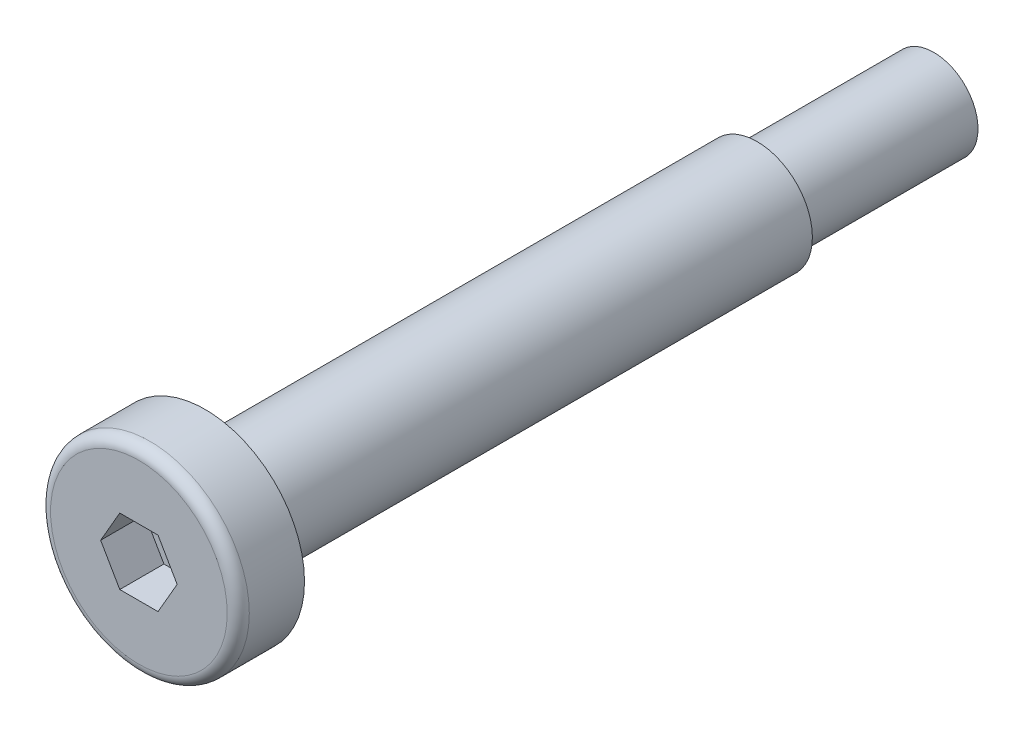
ISO-10303-21;
HEADER;
FILE_DESCRIPTION(('STEP AP214'),'2;1');
FILE_NAME('part.step','',(''),(''),'','','');
FILE_SCHEMA(('AUTOMOTIVE_DESIGN { 1 0 10303 214 1 1 1 1 }'));
ENDSEC;
DATA;
#1=APPLICATION_CONTEXT('core data for automotive mechanical design processes');
#2=APPLICATION_PROTOCOL_DEFINITION('international standard','automotive_design',2000,#1);
#3=PRODUCT_CONTEXT('',#1,'mechanical');
#4=PRODUCT('Part','Part','',(#3));
#5=PRODUCT_RELATED_PRODUCT_CATEGORY('part','',(#4));
#6=PRODUCT_DEFINITION_FORMATION('','',#4);
#7=PRODUCT_DEFINITION_CONTEXT('part definition',#1,'design');
#8=PRODUCT_DEFINITION('design','',#6,#7);
#9=PRODUCT_DEFINITION_SHAPE('','',#8);
#10=(LENGTH_UNIT() NAMED_UNIT(*) SI_UNIT(.MILLI.,.METRE.));
#11=(NAMED_UNIT(*) PLANE_ANGLE_UNIT() SI_UNIT($,.RADIAN.));
#12=(NAMED_UNIT(*) SI_UNIT($,.STERADIAN.) SOLID_ANGLE_UNIT());
#13=UNCERTAINTY_MEASURE_WITH_UNIT(LENGTH_MEASURE(1.E-05),#10,'distance_accuracy_value','');
#14=(GEOMETRIC_REPRESENTATION_CONTEXT(3) GLOBAL_UNCERTAINTY_ASSIGNED_CONTEXT((#13)) GLOBAL_UNIT_ASSIGNED_CONTEXT((#10,
#11,#12)) REPRESENTATION_CONTEXT('',''));
#15=CARTESIAN_POINT('',(0.,0.,0.));
#16=DIRECTION('',(0.,0.,1.));
#17=DIRECTION('',(1.,0.,0.));
#18=AXIS2_PLACEMENT_3D('',#15,#16,#17);
#19=CARTESIAN_POINT('',(0.,0.,3.));
#20=DIRECTION('',(0.,0.,1.));
#21=DIRECTION('',(1.,0.,0.));
#22=AXIS2_PLACEMENT_3D('',#19,#20,#21);
#23=PLANE('',#22);
#24=CARTESIAN_POINT('',(0.,0.,3.));
#25=DIRECTION('',(0.,0.,1.));
#26=DIRECTION('',(1.,0.,0.));
#27=AXIS2_PLACEMENT_3D('',#24,#25,#26);
#28=CIRCLE('',#27,4.);
#29=CARTESIAN_POINT('',(4.,0.,3.));
#30=VERTEX_POINT('',#29);
#31=EDGE_CURVE('E49',#30,#30,#28,.T.);
#32=ORIENTED_EDGE('',*,*,#31,.T.);
#33=EDGE_LOOP('',(#32));
#34=FACE_BOUND('',#33,.T.);
#35=DIRECTION('',(-1.,0.,0.));
#36=VECTOR('',#35,1.);
#37=CARTESIAN_POINT('',(0.,-1.5,3.));
#38=LINE('',#37,#36);
#39=CARTESIAN_POINT('',(0.866025403784439,-1.5,3.));
#40=VERTEX_POINT('',#39);
#41=CARTESIAN_POINT('',(-0.866025403784438,-1.5,3.));
#42=VERTEX_POINT('',#41);
#43=EDGE_CURVE('E136',#40,#42,#38,.T.);
#44=ORIENTED_EDGE('',*,*,#43,.T.);
#45=DIRECTION('',(-0.5,0.866025403784439,0.));
#46=VECTOR('',#45,1.);
#47=CARTESIAN_POINT('',(-1.29903810567666,-0.75,3.));
#48=LINE('',#47,#46);
#49=CARTESIAN_POINT('',(-1.73205080756888,0.,3.));
#50=VERTEX_POINT('',#49);
#51=EDGE_CURVE('E56',#42,#50,#48,.T.);
#52=ORIENTED_EDGE('',*,*,#51,.T.);
#53=DIRECTION('',(0.5,0.866025403784439,0.));
#54=VECTOR('',#53,1.);
#55=CARTESIAN_POINT('',(-1.29903810567666,0.75,3.));
#56=LINE('',#55,#54);
#57=CARTESIAN_POINT('',(-0.866025403784439,1.5,3.));
#58=VERTEX_POINT('',#57);
#59=EDGE_CURVE('E127',#50,#58,#56,.T.);
#60=ORIENTED_EDGE('',*,*,#59,.T.);
#61=DIRECTION('',(1.,0.,0.));
#62=VECTOR('',#61,1.);
#63=CARTESIAN_POINT('',(0.,1.5,3.));
#64=LINE('',#63,#62);
#65=CARTESIAN_POINT('',(0.866025403784438,1.5,3.));
#66=VERTEX_POINT('',#65);
#67=EDGE_CURVE('E130',#58,#66,#64,.T.);
#68=ORIENTED_EDGE('',*,*,#67,.T.);
#69=DIRECTION('',(0.5,-0.866025403784438,0.));
#70=VECTOR('',#69,1.);
#71=CARTESIAN_POINT('',(1.29903810567666,0.750000000000001,3.));
#72=LINE('',#71,#70);
#73=CARTESIAN_POINT('',(1.73205080756888,0.,3.));
#74=VERTEX_POINT('',#73);
#75=EDGE_CURVE('E133',#66,#74,#72,.T.);
#76=ORIENTED_EDGE('',*,*,#75,.T.);
#77=DIRECTION('',(-0.5,-0.866025403784439,0.));
#78=VECTOR('',#77,1.);
#79=CARTESIAN_POINT('',(1.29903810567666,-0.75,3.));
#80=LINE('',#79,#78);
#81=EDGE_CURVE('E117',#74,#40,#80,.T.);
#82=ORIENTED_EDGE('',*,*,#81,.T.);
#83=EDGE_LOOP('',(#44,#52,#60,#68,#76,#82));
#84=FACE_BOUND('',#83,.T.);
#85=ADVANCED_FACE('F41',(#34,#84),#23,.T.);
#86=CARTESIAN_POINT('',(0.,0.,3.));
#87=DIRECTION('',(0.,0.,-1.));
#88=DIRECTION('',(-1.,0.,0.));
#89=AXIS2_PLACEMENT_3D('',#86,#87,#88);
#90=CYLINDRICAL_SURFACE('',#89,4.5);
#91=CARTESIAN_POINT('',(0.,0.,2.5));
#92=DIRECTION('',(0.,0.,1.));
#93=DIRECTION('',(1.,0.,0.));
#94=AXIS2_PLACEMENT_3D('',#91,#92,#93);
#95=CIRCLE('',#94,4.5);
#96=CARTESIAN_POINT('',(4.5,0.,2.5));
#97=VERTEX_POINT('',#96);
#98=EDGE_CURVE('E11',#97,#97,#95,.F.);
#99=ORIENTED_EDGE('',*,*,#98,.T.);
#100=EDGE_LOOP('',(#99));
#101=FACE_BOUND('',#100,.T.);
#102=CARTESIAN_POINT('',(0.,0.,0.));
#103=DIRECTION('',(0.,0.,1.));
#104=DIRECTION('',(1.,0.,0.));
#105=AXIS2_PLACEMENT_3D('',#102,#103,#104);
#106=CIRCLE('',#105,4.5);
#107=CARTESIAN_POINT('',(4.5,0.,0.));
#108=VERTEX_POINT('',#107);
#109=EDGE_CURVE('E157',#108,#108,#106,.T.);
#110=ORIENTED_EDGE('',*,*,#109,.T.);
#111=EDGE_LOOP('',(#110));
#112=FACE_BOUND('',#111,.T.);
#113=ADVANCED_FACE('F176',(#101,#112),#90,.T.);
#114=CARTESIAN_POINT('',(0.,0.,0.));
#115=DIRECTION('',(0.,0.,1.));
#116=DIRECTION('',(1.,0.,0.));
#117=AXIS2_PLACEMENT_3D('',#114,#115,#116);
#118=PLANE('',#117);
#119=CARTESIAN_POINT('',(0.,0.,0.));
#120=DIRECTION('',(0.,0.,1.));
#121=DIRECTION('',(1.,0.,0.));
#122=AXIS2_PLACEMENT_3D('',#119,#120,#121);
#123=CIRCLE('',#122,2.5);
#124=CARTESIAN_POINT('',(2.5,0.,0.));
#125=VERTEX_POINT('',#124);
#126=EDGE_CURVE('E151',#125,#125,#123,.T.);
#127=ORIENTED_EDGE('',*,*,#126,.T.);
#128=EDGE_LOOP('',(#127));
#129=FACE_BOUND('',#128,.T.);
#130=ORIENTED_EDGE('',*,*,#109,.F.);
#131=EDGE_LOOP('',(#130));
#132=FACE_BOUND('',#131,.T.);
#133=ADVANCED_FACE('F180',(#129,#132),#118,.F.);
#134=CARTESIAN_POINT('',(0.,0.,-25.));
#135=DIRECTION('',(0.,0.,1.));
#136=DIRECTION('',(1.,0.,0.));
#137=AXIS2_PLACEMENT_3D('',#134,#135,#136);
#138=CYLINDRICAL_SURFACE('',#137,2.5);
#139=CARTESIAN_POINT('',(0.,0.,-25.));
#140=DIRECTION('',(0.,0.,1.));
#141=DIRECTION('',(1.,0.,0.));
#142=AXIS2_PLACEMENT_3D('',#139,#140,#141);
#143=CIRCLE('',#142,2.5);
#144=CARTESIAN_POINT('',(2.5,0.,-25.));
#145=VERTEX_POINT('',#144);
#146=EDGE_CURVE('E154',#145,#145,#143,.T.);
#147=ORIENTED_EDGE('',*,*,#146,.T.);
#148=EDGE_LOOP('',(#147));
#149=FACE_BOUND('',#148,.T.);
#150=ORIENTED_EDGE('',*,*,#126,.F.);
#151=EDGE_LOOP('',(#150));
#152=FACE_BOUND('',#151,.T.);
#153=ADVANCED_FACE('F184',(#149,#152),#138,.T.);
#154=CARTESIAN_POINT('',(0.,0.,-25.));
#155=DIRECTION('',(0.,0.,1.));
#156=DIRECTION('',(1.,0.,0.));
#157=AXIS2_PLACEMENT_3D('',#154,#155,#156);
#158=PLANE('',#157);
#159=CARTESIAN_POINT('',(0.,0.,-25.));
#160=DIRECTION('',(0.,0.,1.));
#161=DIRECTION('',(1.,0.,0.));
#162=AXIS2_PLACEMENT_3D('',#159,#160,#161);
#163=CIRCLE('',#162,2.);
#164=CARTESIAN_POINT('',(2.,0.,-25.));
#165=VERTEX_POINT('',#164);
#166=EDGE_CURVE('E147',#165,#165,#163,.T.);
#167=ORIENTED_EDGE('',*,*,#166,.T.);
#168=EDGE_LOOP('',(#167));
#169=FACE_BOUND('',#168,.T.);
#170=ORIENTED_EDGE('',*,*,#146,.F.);
#171=EDGE_LOOP('',(#170));
#172=FACE_BOUND('',#171,.T.);
#173=ADVANCED_FACE('F191',(#169,#172),#158,.F.);
#174=CARTESIAN_POINT('',(0.,0.,-33.));
#175=DIRECTION('',(0.,0.,1.));
#176=DIRECTION('',(1.,0.,0.));
#177=AXIS2_PLACEMENT_3D('',#174,#175,#176);
#178=CYLINDRICAL_SURFACE('',#177,2.);
#179=CARTESIAN_POINT('',(0.,0.,-33.));
#180=DIRECTION('',(0.,0.,1.));
#181=DIRECTION('',(1.,0.,0.));
#182=AXIS2_PLACEMENT_3D('',#179,#180,#181);
#183=CIRCLE('',#182,2.);
#184=CARTESIAN_POINT('',(2.,0.,-33.));
#185=VERTEX_POINT('',#184);
#186=EDGE_CURVE('E148',#185,#185,#183,.T.);
#187=ORIENTED_EDGE('',*,*,#186,.T.);
#188=EDGE_LOOP('',(#187));
#189=FACE_BOUND('',#188,.T.);
#190=ORIENTED_EDGE('',*,*,#166,.F.);
#191=EDGE_LOOP('',(#190));
#192=FACE_BOUND('',#191,.T.);
#193=ADVANCED_FACE('F201',(#189,#192),#178,.T.);
#194=CARTESIAN_POINT('',(0.,0.,-33.));
#195=DIRECTION('',(0.,0.,1.));
#196=DIRECTION('',(1.,0.,0.));
#197=AXIS2_PLACEMENT_3D('',#194,#195,#196);
#198=PLANE('',#197);
#199=ORIENTED_EDGE('',*,*,#186,.F.);
#200=EDGE_LOOP('',(#199));
#201=FACE_BOUND('',#200,.T.);
#202=ADVANCED_FACE('F208',(#201),#198,.F.);
#203=CARTESIAN_POINT('',(-1.29903810567666,-0.75,1.));
#204=DIRECTION('',(0.866025403784438,0.5,0.));
#205=DIRECTION('',(-0.5,0.866025403784439,0.));
#206=AXIS2_PLACEMENT_3D('',#203,#204,#205);
#207=PLANE('',#206);
#208=ORIENTED_EDGE('',*,*,#51,.F.);
#209=DIRECTION('',(0.,0.,1.));
#210=VECTOR('',#209,1.);
#211=CARTESIAN_POINT('',(-0.866025403784438,-1.5,1.));
#212=LINE('',#211,#210);
#213=CARTESIAN_POINT('',(-0.866025403784438,-1.5,1.));
#214=VERTEX_POINT('',#213);
#215=EDGE_CURVE('E122',#214,#42,#212,.T.);
#216=ORIENTED_EDGE('',*,*,#215,.F.);
#217=DIRECTION('',(-0.5,0.866025403784439,0.));
#218=VECTOR('',#217,1.);
#219=CARTESIAN_POINT('',(-1.29903810567666,-0.75,1.));
#220=LINE('',#219,#218);
#221=CARTESIAN_POINT('',(-1.73205080756888,0.,1.));
#222=VERTEX_POINT('',#221);
#223=EDGE_CURVE('E139',#214,#222,#220,.T.);
#224=ORIENTED_EDGE('',*,*,#223,.T.);
#225=DIRECTION('',(0.,0.,1.));
#226=VECTOR('',#225,1.);
#227=CARTESIAN_POINT('',(-1.73205080756888,0.,1.));
#228=LINE('',#227,#226);
#229=EDGE_CURVE('E145',#222,#50,#228,.T.);
#230=ORIENTED_EDGE('',*,*,#229,.T.);
#231=EDGE_LOOP('',(#208,#216,#224,#230));
#232=FACE_BOUND('',#231,.T.);
#233=ADVANCED_FACE('F214',(#232),#207,.T.);
#234=CARTESIAN_POINT('',(-1.29903810567666,0.75,1.));
#235=DIRECTION('',(0.866025403784439,-0.5,0.));
#236=DIRECTION('',(0.5,0.866025403784439,0.));
#237=AXIS2_PLACEMENT_3D('',#234,#235,#236);
#238=PLANE('',#237);
#239=ORIENTED_EDGE('',*,*,#59,.F.);
#240=ORIENTED_EDGE('',*,*,#229,.F.);
#241=DIRECTION('',(0.5,0.866025403784439,0.));
#242=VECTOR('',#241,1.);
#243=CARTESIAN_POINT('',(-1.29903810567666,0.75,1.));
#244=LINE('',#243,#242);
#245=CARTESIAN_POINT('',(-0.866025403784439,1.5,1.));
#246=VERTEX_POINT('',#245);
#247=EDGE_CURVE('E95',#222,#246,#244,.T.);
#248=ORIENTED_EDGE('',*,*,#247,.T.);
#249=DIRECTION('',(0.,0.,1.));
#250=VECTOR('',#249,1.);
#251=CARTESIAN_POINT('',(-0.866025403784439,1.5,1.));
#252=LINE('',#251,#250);
#253=EDGE_CURVE('E143',#246,#58,#252,.T.);
#254=ORIENTED_EDGE('',*,*,#253,.T.);
#255=EDGE_LOOP('',(#239,#240,#248,#254));
#256=FACE_BOUND('',#255,.T.);
#257=ADVANCED_FACE('F218',(#256),#238,.T.);
#258=CARTESIAN_POINT('',(0.,1.5,1.));
#259=DIRECTION('',(0.,-1.,0.));
#260=DIRECTION('',(1.,0.,0.));
#261=AXIS2_PLACEMENT_3D('',#258,#259,#260);
#262=PLANE('',#261);
#263=ORIENTED_EDGE('',*,*,#67,.F.);
#264=ORIENTED_EDGE('',*,*,#253,.F.);
#265=DIRECTION('',(1.,0.,0.));
#266=VECTOR('',#265,1.);
#267=CARTESIAN_POINT('',(0.,1.5,1.));
#268=LINE('',#267,#266);
#269=CARTESIAN_POINT('',(0.866025403784438,1.5,1.));
#270=VERTEX_POINT('',#269);
#271=EDGE_CURVE('E113',#246,#270,#268,.T.);
#272=ORIENTED_EDGE('',*,*,#271,.T.);
#273=DIRECTION('',(0.,0.,1.));
#274=VECTOR('',#273,1.);
#275=CARTESIAN_POINT('',(0.866025403784438,1.5,1.));
#276=LINE('',#275,#274);
#277=EDGE_CURVE('E110',#270,#66,#276,.T.);
#278=ORIENTED_EDGE('',*,*,#277,.T.);
#279=EDGE_LOOP('',(#263,#264,#272,#278));
#280=FACE_BOUND('',#279,.T.);
#281=ADVANCED_FACE('F221',(#280),#262,.T.);
#282=CARTESIAN_POINT('',(1.29903810567666,0.750000000000001,1.));
#283=DIRECTION('',(-0.866025403784438,-0.5,0.));
#284=DIRECTION('',(0.5,-0.866025403784438,0.));
#285=AXIS2_PLACEMENT_3D('',#282,#283,#284);
#286=PLANE('',#285);
#287=ORIENTED_EDGE('',*,*,#75,.F.);
#288=ORIENTED_EDGE('',*,*,#277,.F.);
#289=DIRECTION('',(0.5,-0.866025403784438,0.));
#290=VECTOR('',#289,1.);
#291=CARTESIAN_POINT('',(1.29903810567666,0.750000000000001,1.));
#292=LINE('',#291,#290);
#293=CARTESIAN_POINT('',(1.73205080756888,0.,1.));
#294=VERTEX_POINT('',#293);
#295=EDGE_CURVE('E105',#270,#294,#292,.T.);
#296=ORIENTED_EDGE('',*,*,#295,.T.);
#297=DIRECTION('',(0.,0.,1.));
#298=VECTOR('',#297,1.);
#299=CARTESIAN_POINT('',(1.73205080756888,0.,1.));
#300=LINE('',#299,#298);
#301=EDGE_CURVE('E109',#294,#74,#300,.T.);
#302=ORIENTED_EDGE('',*,*,#301,.T.);
#303=EDGE_LOOP('',(#287,#288,#296,#302));
#304=FACE_BOUND('',#303,.T.);
#305=ADVANCED_FACE('F108',(#304),#286,.T.);
#306=CARTESIAN_POINT('',(1.29903810567666,-0.75,1.));
#307=DIRECTION('',(-0.866025403784439,0.5,0.));
#308=DIRECTION('',(-0.5,-0.866025403784439,0.));
#309=AXIS2_PLACEMENT_3D('',#306,#307,#308);
#310=PLANE('',#309);
#311=ORIENTED_EDGE('',*,*,#81,.F.);
#312=ORIENTED_EDGE('',*,*,#301,.F.);
#313=DIRECTION('',(-0.5,-0.866025403784439,0.));
#314=VECTOR('',#313,1.);
#315=CARTESIAN_POINT('',(1.29903810567666,-0.75,1.));
#316=LINE('',#315,#314);
#317=CARTESIAN_POINT('',(0.866025403784439,-1.5,1.));
#318=VERTEX_POINT('',#317);
#319=EDGE_CURVE('E112',#294,#318,#316,.T.);
#320=ORIENTED_EDGE('',*,*,#319,.T.);
#321=DIRECTION('',(0.,0.,1.));
#322=VECTOR('',#321,1.);
#323=CARTESIAN_POINT('',(0.866025403784439,-1.5,1.));
#324=LINE('',#323,#322);
#325=EDGE_CURVE('E86',#318,#40,#324,.T.);
#326=ORIENTED_EDGE('',*,*,#325,.T.);
#327=EDGE_LOOP('',(#311,#312,#320,#326));
#328=FACE_BOUND('',#327,.T.);
#329=ADVANCED_FACE('F115',(#328),#310,.T.);
#330=CARTESIAN_POINT('',(0.,-1.5,1.));
#331=DIRECTION('',(0.,1.,0.));
#332=DIRECTION('',(0.,0.,1.));
#333=AXIS2_PLACEMENT_3D('',#330,#331,#332);
#334=PLANE('',#333);
#335=ORIENTED_EDGE('',*,*,#43,.F.);
#336=ORIENTED_EDGE('',*,*,#325,.F.);
#337=DIRECTION('',(-1.,0.,0.));
#338=VECTOR('',#337,1.);
#339=CARTESIAN_POINT('',(0.,-1.5,1.));
#340=LINE('',#339,#338);
#341=EDGE_CURVE('E64',#318,#214,#340,.T.);
#342=ORIENTED_EDGE('',*,*,#341,.T.);
#343=ORIENTED_EDGE('',*,*,#215,.T.);
#344=EDGE_LOOP('',(#335,#336,#342,#343));
#345=FACE_BOUND('',#344,.T.);
#346=ADVANCED_FACE('F172',(#345),#334,.T.);
#347=CARTESIAN_POINT('',(0.,0.,1.));
#348=DIRECTION('',(0.,0.,-1.));
#349=DIRECTION('',(-1.,0.,0.));
#350=AXIS2_PLACEMENT_3D('',#347,#348,#349);
#351=PLANE('',#350);
#352=ORIENTED_EDGE('',*,*,#223,.F.);
#353=ORIENTED_EDGE('',*,*,#341,.F.);
#354=ORIENTED_EDGE('',*,*,#319,.F.);
#355=ORIENTED_EDGE('',*,*,#295,.F.);
#356=ORIENTED_EDGE('',*,*,#271,.F.);
#357=ORIENTED_EDGE('',*,*,#247,.F.);
#358=EDGE_LOOP('',(#352,#353,#354,#355,#356,#357));
#359=FACE_BOUND('',#358,.T.);
#360=ADVANCED_FACE('F120',(#359),#351,.F.);
#361=CARTESIAN_POINT('',(0.,0.,2.5));
#362=DIRECTION('',(0.,0.,1.));
#363=DIRECTION('',(1.,0.,0.));
#364=AXIS2_PLACEMENT_3D('',#361,#362,#363);
#365=TOROIDAL_SURFACE('',#364,4.,0.5);
#366=ORIENTED_EDGE('',*,*,#98,.F.);
#367=EDGE_LOOP('',(#366));
#368=FACE_BOUND('',#367,.T.);
#369=ORIENTED_EDGE('',*,*,#31,.F.);
#370=EDGE_LOOP('',(#369));
#371=FACE_BOUND('',#370,.T.);
#372=ADVANCED_FACE('F43',(#368,#371),#365,.T.);
#373=CLOSED_SHELL('',(#85,#113,#133,#153,#173,#193,#202,#233,#257,#281,#305,#329,#346,#360,#372));
#374=MANIFOLD_SOLID_BREP('B2',#373);
#375=ADVANCED_BREP_SHAPE_REPRESENTATION('',(#18,#374),#14);
#376=SHAPE_DEFINITION_REPRESENTATION(#9,#375);
ENDSEC;
END-ISO-10303-21;
